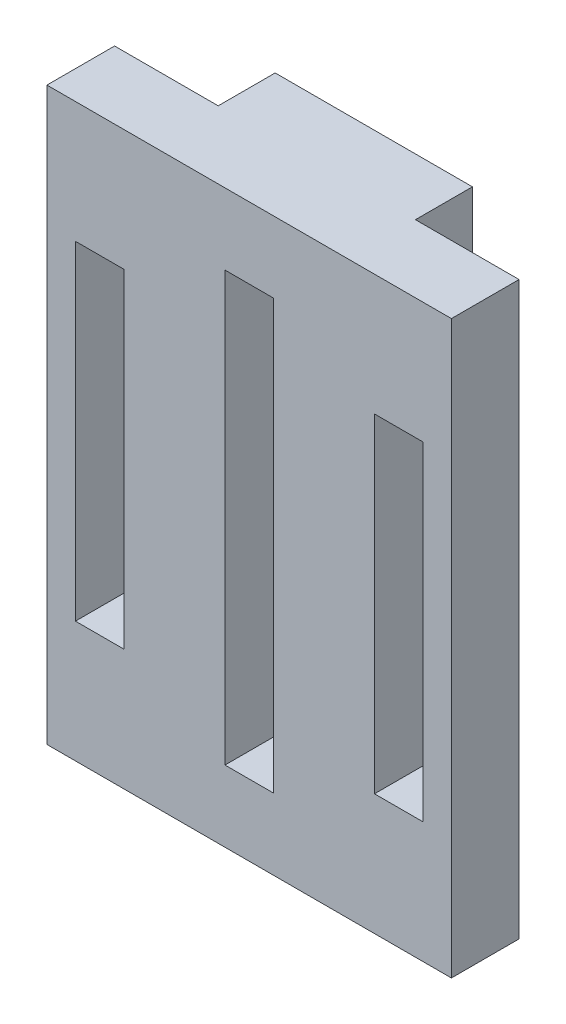
ISO-10303-21;
HEADER;
FILE_DESCRIPTION(('STEP AP214'),'2;1');
FILE_NAME('part.step','',(''),(''),'','','');
FILE_SCHEMA(('AUTOMOTIVE_DESIGN { 1 0 10303 214 1 1 1 1 }'));
ENDSEC;
DATA;
#1=APPLICATION_CONTEXT('core data for automotive mechanical design processes');
#2=APPLICATION_PROTOCOL_DEFINITION('international standard','automotive_design',2000,#1);
#3=PRODUCT_CONTEXT('',#1,'mechanical');
#4=PRODUCT('Part','Part','',(#3));
#5=PRODUCT_RELATED_PRODUCT_CATEGORY('part','',(#4));
#6=PRODUCT_DEFINITION_FORMATION('','',#4);
#7=PRODUCT_DEFINITION_CONTEXT('part definition',#1,'design');
#8=PRODUCT_DEFINITION('design','',#6,#7);
#9=PRODUCT_DEFINITION_SHAPE('','',#8);
#10=(LENGTH_UNIT() NAMED_UNIT(*) SI_UNIT(.MILLI.,.METRE.));
#11=(NAMED_UNIT(*) PLANE_ANGLE_UNIT() SI_UNIT($,.RADIAN.));
#12=(NAMED_UNIT(*) SI_UNIT($,.STERADIAN.) SOLID_ANGLE_UNIT());
#13=UNCERTAINTY_MEASURE_WITH_UNIT(LENGTH_MEASURE(1.E-05),#10,'distance_accuracy_value','');
#14=(GEOMETRIC_REPRESENTATION_CONTEXT(3) GLOBAL_UNCERTAINTY_ASSIGNED_CONTEXT((#13)) GLOBAL_UNIT_ASSIGNED_CONTEXT((#10,
#11,#12)) REPRESENTATION_CONTEXT('',''));
#15=CARTESIAN_POINT('',(0.,0.,0.));
#16=DIRECTION('',(0.,0.,1.));
#17=DIRECTION('',(1.,0.,0.));
#18=AXIS2_PLACEMENT_3D('',#15,#16,#17);
#19=CARTESIAN_POINT('',(0.,0.,0.));
#20=DIRECTION('',(0.,0.,1.));
#21=DIRECTION('',(1.,0.,0.));
#22=AXIS2_PLACEMENT_3D('',#19,#20,#21);
#23=PLANE('',#22);
#24=DIRECTION('',(1.,0.,0.));
#25=VECTOR('',#24,1.);
#26=CARTESIAN_POINT('',(12.2,-11.55,0.));
#27=LINE('',#26,#25);
#28=CARTESIAN_POINT('',(8.8,-11.55,0.));
#29=VERTEX_POINT('',#28);
#30=CARTESIAN_POINT('',(12.2,-11.55,0.));
#31=VERTEX_POINT('',#30);
#32=EDGE_CURVE('E348',#29,#31,#27,.T.);
#33=ORIENTED_EDGE('',*,*,#32,.T.);
#34=DIRECTION('',(0.,1.,0.));
#35=VECTOR('',#34,1.);
#36=CARTESIAN_POINT('',(12.2,-11.55,0.));
#37=LINE('',#36,#35);
#38=CARTESIAN_POINT('',(12.2,11.55,0.));
#39=VERTEX_POINT('',#38);
#40=EDGE_CURVE('E364',#31,#39,#37,.T.);
#41=ORIENTED_EDGE('',*,*,#40,.T.);
#42=DIRECTION('',(-1.,0.,0.));
#43=VECTOR('',#42,1.);
#44=CARTESIAN_POINT('',(12.2,11.55,0.));
#45=LINE('',#44,#43);
#46=CARTESIAN_POINT('',(8.8,11.55,0.));
#47=VERTEX_POINT('',#46);
#48=EDGE_CURVE('E381',#39,#47,#45,.T.);
#49=ORIENTED_EDGE('',*,*,#48,.T.);
#50=DIRECTION('',(0.,-1.,0.));
#51=VECTOR('',#50,1.);
#52=CARTESIAN_POINT('',(8.8,-11.55,0.));
#53=LINE('',#52,#51);
#54=EDGE_CURVE('E377',#47,#29,#53,.T.);
#55=ORIENTED_EDGE('',*,*,#54,.T.);
#56=EDGE_LOOP('',(#33,#41,#49,#55));
#57=FACE_BOUND('',#56,.T.);
#58=DIRECTION('',(1.,0.,0.));
#59=VECTOR('',#58,1.);
#60=CARTESIAN_POINT('',(-12.2,-11.55,0.));
#61=LINE('',#60,#59);
#62=CARTESIAN_POINT('',(-12.2,-11.55,0.));
#63=VERTEX_POINT('',#62);
#64=CARTESIAN_POINT('',(-8.8,-11.55,0.));
#65=VERTEX_POINT('',#64);
#66=EDGE_CURVE('E311',#63,#65,#61,.T.);
#67=ORIENTED_EDGE('',*,*,#66,.T.);
#68=DIRECTION('',(0.,1.,0.));
#69=VECTOR('',#68,1.);
#70=CARTESIAN_POINT('',(-8.8,-11.55,0.));
#71=LINE('',#70,#69);
#72=CARTESIAN_POINT('',(-8.8,11.55,0.));
#73=VERTEX_POINT('',#72);
#74=EDGE_CURVE('E298',#65,#73,#71,.T.);
#75=ORIENTED_EDGE('',*,*,#74,.T.);
#76=DIRECTION('',(-1.,0.,0.));
#77=VECTOR('',#76,1.);
#78=CARTESIAN_POINT('',(-12.2,11.55,0.));
#79=LINE('',#78,#77);
#80=CARTESIAN_POINT('',(-12.2,11.55,0.));
#81=VERTEX_POINT('',#80);
#82=EDGE_CURVE('E302',#73,#81,#79,.T.);
#83=ORIENTED_EDGE('',*,*,#82,.T.);
#84=DIRECTION('',(0.,-1.,0.));
#85=VECTOR('',#84,1.);
#86=CARTESIAN_POINT('',(-12.2,-11.55,0.));
#87=LINE('',#86,#85);
#88=EDGE_CURVE('E307',#81,#63,#87,.T.);
#89=ORIENTED_EDGE('',*,*,#88,.T.);
#90=EDGE_LOOP('',(#67,#75,#83,#89));
#91=FACE_BOUND('',#90,.T.);
#92=DIRECTION('',(0.,-1.,0.));
#93=VECTOR('',#92,1.);
#94=CARTESIAN_POINT('',(6.925,20.05,0.));
#95=LINE('',#94,#93);
#96=CARTESIAN_POINT('',(6.925,20.05,0.));
#97=VERTEX_POINT('',#96);
#98=CARTESIAN_POINT('',(6.925,-18.05,0.));
#99=VERTEX_POINT('',#98);
#100=EDGE_CURVE('E228',#97,#99,#95,.T.);
#101=ORIENTED_EDGE('',*,*,#100,.F.);
#102=DIRECTION('',(-1.,0.,0.));
#103=VECTOR('',#102,1.);
#104=CARTESIAN_POINT('',(-14.2,20.05,0.));
#105=LINE('',#104,#103);
#106=CARTESIAN_POINT('',(14.2,20.05,0.));
#107=VERTEX_POINT('',#106);
#108=EDGE_CURVE('E440',#107,#97,#105,.T.);
#109=ORIENTED_EDGE('',*,*,#108,.F.);
#110=DIRECTION('',(0.,1.,0.));
#111=VECTOR('',#110,1.);
#112=CARTESIAN_POINT('',(14.2,20.05,0.));
#113=LINE('',#112,#111);
#114=CARTESIAN_POINT('',(14.2,-20.05,0.));
#115=VERTEX_POINT('',#114);
#116=EDGE_CURVE('E334',#115,#107,#113,.T.);
#117=ORIENTED_EDGE('',*,*,#116,.F.);
#118=DIRECTION('',(1.,0.,0.));
#119=VECTOR('',#118,1.);
#120=CARTESIAN_POINT('',(-14.2,-20.05,0.));
#121=LINE('',#120,#119);
#122=CARTESIAN_POINT('',(-14.2,-20.05,0.));
#123=VERTEX_POINT('',#122);
#124=EDGE_CURVE('E426',#123,#115,#121,.T.);
#125=ORIENTED_EDGE('',*,*,#124,.F.);
#126=DIRECTION('',(0.,-1.,0.));
#127=VECTOR('',#126,1.);
#128=CARTESIAN_POINT('',(-14.2,20.05,0.));
#129=LINE('',#128,#127);
#130=CARTESIAN_POINT('',(-14.2,20.05,0.));
#131=VERTEX_POINT('',#130);
#132=EDGE_CURVE('E444',#131,#123,#129,.T.);
#133=ORIENTED_EDGE('',*,*,#132,.F.);
#134=CARTESIAN_POINT('',(-6.925,20.05,0.));
#135=VERTEX_POINT('',#134);
#136=EDGE_CURVE('E439',#135,#131,#105,.T.);
#137=ORIENTED_EDGE('',*,*,#136,.F.);
#138=DIRECTION('',(0.,1.,0.));
#139=VECTOR('',#138,1.);
#140=CARTESIAN_POINT('',(-6.925,20.05,0.));
#141=LINE('',#140,#139);
#142=CARTESIAN_POINT('',(-6.925,-18.05,0.));
#143=VERTEX_POINT('',#142);
#144=EDGE_CURVE('E265',#143,#135,#141,.T.);
#145=ORIENTED_EDGE('',*,*,#144,.F.);
#146=DIRECTION('',(-1.,0.,0.));
#147=VECTOR('',#146,1.);
#148=CARTESIAN_POINT('',(6.925,-18.05,0.));
#149=LINE('',#148,#147);
#150=EDGE_CURVE('E64',#99,#143,#149,.T.);
#151=ORIENTED_EDGE('',*,*,#150,.F.);
#152=EDGE_LOOP('',(#101,#109,#117,#125,#133,#137,#145,#151));
#153=FACE_BOUND('',#152,.T.);
#154=ADVANCED_FACE('F45',(#57,#91,#153),#23,.F.);
#155=DIRECTION('',(0.,1.,0.));
#156=VECTOR('',#155,1.);
#157=CARTESIAN_POINT('',(1.7,15.05,0.));
#158=LINE('',#157,#156);
#159=CARTESIAN_POINT('',(1.7,-15.05,0.));
#160=VERTEX_POINT('',#159);
#161=CARTESIAN_POINT('',(1.7,15.05,0.));
#162=VERTEX_POINT('',#161);
#163=EDGE_CURVE('E406',#160,#162,#158,.T.);
#164=ORIENTED_EDGE('',*,*,#163,.T.);
#165=DIRECTION('',(1.,0.,0.));
#166=VECTOR('',#165,1.);
#167=CARTESIAN_POINT('',(3.925,15.05,0.));
#168=LINE('',#167,#166);
#169=CARTESIAN_POINT('',(3.925,15.05,0.));
#170=VERTEX_POINT('',#169);
#171=EDGE_CURVE('E11',#162,#170,#168,.T.);
#172=ORIENTED_EDGE('',*,*,#171,.T.);
#173=DIRECTION('',(0.,-1.,0.));
#174=VECTOR('',#173,1.);
#175=CARTESIAN_POINT('',(3.925,15.05,0.));
#176=LINE('',#175,#174);
#177=CARTESIAN_POINT('',(3.925,-15.05,0.));
#178=VERTEX_POINT('',#177);
#179=EDGE_CURVE('E247',#170,#178,#176,.T.);
#180=ORIENTED_EDGE('',*,*,#179,.T.);
#181=DIRECTION('',(-1.,0.,0.));
#182=VECTOR('',#181,1.);
#183=CARTESIAN_POINT('',(3.925,-15.05,0.));
#184=LINE('',#183,#182);
#185=EDGE_CURVE('E220',#178,#160,#184,.T.);
#186=ORIENTED_EDGE('',*,*,#185,.T.);
#187=EDGE_LOOP('',(#164,#172,#180,#186));
#188=FACE_BOUND('',#187,.T.);
#189=ADVANCED_FACE('F489',(#188),#23,.F.);
#190=CARTESIAN_POINT('',(14.2,20.05,4.75));
#191=DIRECTION('',(-1.,0.,0.));
#192=DIRECTION('',(0.,-1.,0.));
#193=AXIS2_PLACEMENT_3D('',#190,#191,#192);
#194=PLANE('',#193);
#195=ORIENTED_EDGE('',*,*,#116,.T.);
#196=DIRECTION('',(0.,0.,-1.));
#197=VECTOR('',#196,1.);
#198=CARTESIAN_POINT('',(14.2,20.05,4.75));
#199=LINE('',#198,#197);
#200=CARTESIAN_POINT('',(14.2,20.05,4.75));
#201=VERTEX_POINT('',#200);
#202=EDGE_CURVE('E49',#201,#107,#199,.T.);
#203=ORIENTED_EDGE('',*,*,#202,.F.);
#204=DIRECTION('',(0.,1.,0.));
#205=VECTOR('',#204,1.);
#206=CARTESIAN_POINT('',(14.2,20.05,4.75));
#207=LINE('',#206,#205);
#208=CARTESIAN_POINT('',(14.2,-20.05,4.75));
#209=VERTEX_POINT('',#208);
#210=EDGE_CURVE('E421',#209,#201,#207,.T.);
#211=ORIENTED_EDGE('',*,*,#210,.F.);
#212=DIRECTION('',(0.,0.,-1.));
#213=VECTOR('',#212,1.);
#214=CARTESIAN_POINT('',(14.2,-20.05,4.75));
#215=LINE('',#214,#213);
#216=EDGE_CURVE('E435',#209,#115,#215,.T.);
#217=ORIENTED_EDGE('',*,*,#216,.T.);
#218=EDGE_LOOP('',(#195,#203,#211,#217));
#219=FACE_BOUND('',#218,.T.);
#220=ADVANCED_FACE('F47',(#219),#194,.F.);
#221=CARTESIAN_POINT('',(-14.2,20.05,4.75));
#222=DIRECTION('',(0.,-1.,0.));
#223=DIRECTION('',(0.,0.,-1.));
#224=AXIS2_PLACEMENT_3D('',#221,#222,#223);
#225=PLANE('',#224);
#226=ORIENTED_EDGE('',*,*,#108,.T.);
#227=DIRECTION('',(0.,0.,1.));
#228=VECTOR('',#227,1.);
#229=CARTESIAN_POINT('',(6.925,20.05,-4.));
#230=LINE('',#229,#228);
#231=CARTESIAN_POINT('',(6.925,20.05,-4.));
#232=VERTEX_POINT('',#231);
#233=EDGE_CURVE('E274',#232,#97,#230,.T.);
#234=ORIENTED_EDGE('',*,*,#233,.F.);
#235=DIRECTION('',(1.,0.,0.));
#236=VECTOR('',#235,1.);
#237=CARTESIAN_POINT('',(6.925,20.05,-4.));
#238=LINE('',#237,#236);
#239=CARTESIAN_POINT('',(-6.925,20.05,-4.));
#240=VERTEX_POINT('',#239);
#241=EDGE_CURVE('E271',#240,#232,#238,.T.);
#242=ORIENTED_EDGE('',*,*,#241,.F.);
#243=DIRECTION('',(0.,0.,1.));
#244=VECTOR('',#243,1.);
#245=CARTESIAN_POINT('',(-6.925,20.05,-4.));
#246=LINE('',#245,#244);
#247=EDGE_CURVE('E286',#240,#135,#246,.T.);
#248=ORIENTED_EDGE('',*,*,#247,.T.);
#249=ORIENTED_EDGE('',*,*,#136,.T.);
#250=DIRECTION('',(0.,0.,-1.));
#251=VECTOR('',#250,1.);
#252=CARTESIAN_POINT('',(-14.2,20.05,4.75));
#253=LINE('',#252,#251);
#254=CARTESIAN_POINT('',(-14.2,20.05,4.75));
#255=VERTEX_POINT('',#254);
#256=EDGE_CURVE('E455',#255,#131,#253,.T.);
#257=ORIENTED_EDGE('',*,*,#256,.F.);
#258=DIRECTION('',(-1.,0.,0.));
#259=VECTOR('',#258,1.);
#260=CARTESIAN_POINT('',(-14.2,20.05,4.75));
#261=LINE('',#260,#259);
#262=EDGE_CURVE('E425',#201,#255,#261,.T.);
#263=ORIENTED_EDGE('',*,*,#262,.F.);
#264=ORIENTED_EDGE('',*,*,#202,.T.);
#265=EDGE_LOOP('',(#226,#234,#242,#248,#249,#257,#263,#264));
#266=FACE_BOUND('',#265,.T.);
#267=ADVANCED_FACE('F586',(#266),#225,.F.);
#268=CARTESIAN_POINT('',(-14.2,20.05,4.75));
#269=DIRECTION('',(1.,0.,0.));
#270=DIRECTION('',(0.,1.,0.));
#271=AXIS2_PLACEMENT_3D('',#268,#269,#270);
#272=PLANE('',#271);
#273=ORIENTED_EDGE('',*,*,#132,.T.);
#274=DIRECTION('',(0.,0.,-1.));
#275=VECTOR('',#274,1.);
#276=CARTESIAN_POINT('',(-14.2,-20.05,4.75));
#277=LINE('',#276,#275);
#278=CARTESIAN_POINT('',(-14.2,-20.05,4.75));
#279=VERTEX_POINT('',#278);
#280=EDGE_CURVE('E452',#279,#123,#277,.T.);
#281=ORIENTED_EDGE('',*,*,#280,.F.);
#282=DIRECTION('',(0.,-1.,0.));
#283=VECTOR('',#282,1.);
#284=CARTESIAN_POINT('',(-14.2,20.05,4.75));
#285=LINE('',#284,#283);
#286=EDGE_CURVE('E429',#255,#279,#285,.T.);
#287=ORIENTED_EDGE('',*,*,#286,.F.);
#288=ORIENTED_EDGE('',*,*,#256,.T.);
#289=EDGE_LOOP('',(#273,#281,#287,#288));
#290=FACE_BOUND('',#289,.T.);
#291=ADVANCED_FACE('F523',(#290),#272,.F.);
#292=CARTESIAN_POINT('',(-14.2,-20.05,4.75));
#293=DIRECTION('',(0.,1.,0.));
#294=DIRECTION('',(0.,0.,1.));
#295=AXIS2_PLACEMENT_3D('',#292,#293,#294);
#296=PLANE('',#295);
#297=ORIENTED_EDGE('',*,*,#124,.T.);
#298=ORIENTED_EDGE('',*,*,#216,.F.);
#299=DIRECTION('',(1.,0.,0.));
#300=VECTOR('',#299,1.);
#301=CARTESIAN_POINT('',(-14.2,-20.05,4.75));
#302=LINE('',#301,#300);
#303=EDGE_CURVE('E432',#279,#209,#302,.T.);
#304=ORIENTED_EDGE('',*,*,#303,.F.);
#305=ORIENTED_EDGE('',*,*,#280,.T.);
#306=EDGE_LOOP('',(#297,#298,#304,#305));
#307=FACE_BOUND('',#306,.T.);
#308=ADVANCED_FACE('F517',(#307),#296,.F.);
#309=CARTESIAN_POINT('',(0.,0.,4.75));
#310=DIRECTION('',(0.,0.,1.));
#311=DIRECTION('',(1.,0.,0.));
#312=AXIS2_PLACEMENT_3D('',#309,#310,#311);
#313=PLANE('',#312);
#314=DIRECTION('',(0.,1.,0.));
#315=VECTOR('',#314,1.);
#316=CARTESIAN_POINT('',(-8.8,-11.55,4.75));
#317=LINE('',#316,#315);
#318=CARTESIAN_POINT('',(-8.8,-11.55,4.75));
#319=VERTEX_POINT('',#318);
#320=CARTESIAN_POINT('',(-8.8,11.55,4.75));
#321=VERTEX_POINT('',#320);
#322=EDGE_CURVE('E316',#319,#321,#317,.T.);
#323=ORIENTED_EDGE('',*,*,#322,.F.);
#324=DIRECTION('',(1.,0.,0.));
#325=VECTOR('',#324,1.);
#326=CARTESIAN_POINT('',(-12.2,-11.55,4.75));
#327=LINE('',#326,#325);
#328=CARTESIAN_POINT('',(-12.2,-11.55,4.75));
#329=VERTEX_POINT('',#328);
#330=EDGE_CURVE('E303',#329,#319,#327,.T.);
#331=ORIENTED_EDGE('',*,*,#330,.F.);
#332=DIRECTION('',(0.,-1.,0.));
#333=VECTOR('',#332,1.);
#334=CARTESIAN_POINT('',(-12.2,-11.55,4.75));
#335=LINE('',#334,#333);
#336=CARTESIAN_POINT('',(-12.2,11.55,4.75));
#337=VERTEX_POINT('',#336);
#338=EDGE_CURVE('E324',#337,#329,#335,.T.);
#339=ORIENTED_EDGE('',*,*,#338,.F.);
#340=DIRECTION('',(-1.,0.,0.));
#341=VECTOR('',#340,1.);
#342=CARTESIAN_POINT('',(-12.2,11.55,4.75));
#343=LINE('',#342,#341);
#344=EDGE_CURVE('E319',#321,#337,#343,.T.);
#345=ORIENTED_EDGE('',*,*,#344,.F.);
#346=EDGE_LOOP('',(#323,#331,#339,#345));
#347=FACE_BOUND('',#346,.T.);
#348=DIRECTION('',(0.,1.,0.));
#349=VECTOR('',#348,1.);
#350=CARTESIAN_POINT('',(12.2,-11.55,4.75));
#351=LINE('',#350,#349);
#352=CARTESIAN_POINT('',(12.2,-11.55,4.75));
#353=VERTEX_POINT('',#352);
#354=CARTESIAN_POINT('',(12.2,11.55,4.75));
#355=VERTEX_POINT('',#354);
#356=EDGE_CURVE('E320',#353,#355,#351,.T.);
#357=ORIENTED_EDGE('',*,*,#356,.F.);
#358=DIRECTION('',(1.,0.,0.));
#359=VECTOR('',#358,1.);
#360=CARTESIAN_POINT('',(12.2,-11.55,4.75));
#361=LINE('',#360,#359);
#362=CARTESIAN_POINT('',(8.8,-11.55,4.75));
#363=VERTEX_POINT('',#362);
#364=EDGE_CURVE('E359',#363,#353,#361,.T.);
#365=ORIENTED_EDGE('',*,*,#364,.F.);
#366=DIRECTION('',(0.,-1.,0.));
#367=VECTOR('',#366,1.);
#368=CARTESIAN_POINT('',(8.8,-11.55,4.75));
#369=LINE('',#368,#367);
#370=CARTESIAN_POINT('',(8.8,11.55,4.75));
#371=VERTEX_POINT('',#370);
#372=EDGE_CURVE('E363',#371,#363,#369,.T.);
#373=ORIENTED_EDGE('',*,*,#372,.F.);
#374=DIRECTION('',(-1.,0.,0.));
#375=VECTOR('',#374,1.);
#376=CARTESIAN_POINT('',(12.2,11.55,4.75));
#377=LINE('',#376,#375);
#378=EDGE_CURVE('E368',#355,#371,#377,.T.);
#379=ORIENTED_EDGE('',*,*,#378,.F.);
#380=EDGE_LOOP('',(#357,#365,#373,#379));
#381=FACE_BOUND('',#380,.T.);
#382=DIRECTION('',(0.,1.,0.));
#383=VECTOR('',#382,1.);
#384=CARTESIAN_POINT('',(1.7,15.05,4.75));
#385=LINE('',#384,#383);
#386=CARTESIAN_POINT('',(1.7,-15.05,4.75));
#387=VERTEX_POINT('',#386);
#388=CARTESIAN_POINT('',(1.7,15.05,4.75));
#389=VERTEX_POINT('',#388);
#390=EDGE_CURVE('E358',#387,#389,#385,.T.);
#391=ORIENTED_EDGE('',*,*,#390,.F.);
#392=DIRECTION('',(1.,0.,0.));
#393=VECTOR('',#392,1.);
#394=CARTESIAN_POINT('',(-1.7,-15.05,4.75));
#395=LINE('',#394,#393);
#396=CARTESIAN_POINT('',(-1.7,-15.05,4.75));
#397=VERTEX_POINT('',#396);
#398=EDGE_CURVE('E401',#397,#387,#395,.T.);
#399=ORIENTED_EDGE('',*,*,#398,.F.);
#400=DIRECTION('',(0.,-1.,0.));
#401=VECTOR('',#400,1.);
#402=CARTESIAN_POINT('',(-1.7,15.05,4.75));
#403=LINE('',#402,#401);
#404=CARTESIAN_POINT('',(-1.7,15.05,4.75));
#405=VERTEX_POINT('',#404);
#406=EDGE_CURVE('E405',#405,#397,#403,.T.);
#407=ORIENTED_EDGE('',*,*,#406,.F.);
#408=DIRECTION('',(-1.,0.,0.));
#409=VECTOR('',#408,1.);
#410=CARTESIAN_POINT('',(-1.7,15.05,4.75));
#411=LINE('',#410,#409);
#412=EDGE_CURVE('E410',#389,#405,#411,.T.);
#413=ORIENTED_EDGE('',*,*,#412,.F.);
#414=EDGE_LOOP('',(#391,#399,#407,#413));
#415=FACE_BOUND('',#414,.T.);
#416=ORIENTED_EDGE('',*,*,#210,.T.);
#417=ORIENTED_EDGE('',*,*,#262,.T.);
#418=ORIENTED_EDGE('',*,*,#286,.T.);
#419=ORIENTED_EDGE('',*,*,#303,.T.);
#420=EDGE_LOOP('',(#416,#417,#418,#419));
#421=FACE_BOUND('',#420,.T.);
#422=ADVANCED_FACE('F480',(#347,#381,#415,#421),#313,.T.);
#423=DIRECTION('',(0.,1.,0.));
#424=VECTOR('',#423,1.);
#425=CARTESIAN_POINT('',(-3.925,15.05,0.));
#426=LINE('',#425,#424);
#427=CARTESIAN_POINT('',(-3.925,-15.05,0.));
#428=VERTEX_POINT('',#427);
#429=CARTESIAN_POINT('',(-3.925,15.05,0.));
#430=VERTEX_POINT('',#429);
#431=EDGE_CURVE('E243',#428,#430,#426,.T.);
#432=ORIENTED_EDGE('',*,*,#431,.T.);
#433=CARTESIAN_POINT('',(-1.7,15.05,0.));
#434=VERTEX_POINT('',#433);
#435=EDGE_CURVE('E57',#430,#434,#168,.T.);
#436=ORIENTED_EDGE('',*,*,#435,.T.);
#437=DIRECTION('',(0.,-1.,0.));
#438=VECTOR('',#437,1.);
#439=CARTESIAN_POINT('',(-1.7,15.05,0.));
#440=LINE('',#439,#438);
#441=CARTESIAN_POINT('',(-1.7,-15.05,0.));
#442=VERTEX_POINT('',#441);
#443=EDGE_CURVE('E392',#434,#442,#440,.T.);
#444=ORIENTED_EDGE('',*,*,#443,.T.);
#445=EDGE_CURVE('E55',#442,#428,#184,.T.);
#446=ORIENTED_EDGE('',*,*,#445,.T.);
#447=EDGE_LOOP('',(#432,#436,#444,#446));
#448=FACE_BOUND('',#447,.T.);
#449=ADVANCED_FACE('F469',(#448),#23,.F.);
#450=CARTESIAN_POINT('',(1.7,15.05,0.));
#451=DIRECTION('',(1.,0.,0.));
#452=DIRECTION('',(0.,1.,0.));
#453=AXIS2_PLACEMENT_3D('',#450,#451,#452);
#454=PLANE('',#453);
#455=ORIENTED_EDGE('',*,*,#390,.T.);
#456=DIRECTION('',(0.,0.,1.));
#457=VECTOR('',#456,1.);
#458=CARTESIAN_POINT('',(1.7,15.05,0.));
#459=LINE('',#458,#457);
#460=EDGE_CURVE('E388',#162,#389,#459,.T.);
#461=ORIENTED_EDGE('',*,*,#460,.F.);
#462=ORIENTED_EDGE('',*,*,#163,.F.);
#463=DIRECTION('',(0.,0.,1.));
#464=VECTOR('',#463,1.);
#465=CARTESIAN_POINT('',(1.7,-15.05,0.));
#466=LINE('',#465,#464);
#467=EDGE_CURVE('E297',#160,#387,#466,.T.);
#468=ORIENTED_EDGE('',*,*,#467,.T.);
#469=EDGE_LOOP('',(#455,#461,#462,#468));
#470=FACE_BOUND('',#469,.T.);
#471=ADVANCED_FACE('F487',(#470),#454,.F.);
#472=CARTESIAN_POINT('',(-1.7,-15.05,0.));
#473=DIRECTION('',(0.,-1.,0.));
#474=DIRECTION('',(0.,0.,-1.));
#475=AXIS2_PLACEMENT_3D('',#472,#473,#474);
#476=PLANE('',#475);
#477=ORIENTED_EDGE('',*,*,#398,.T.);
#478=ORIENTED_EDGE('',*,*,#467,.F.);
#479=ORIENTED_EDGE('',*,*,#185,.F.);
#480=DIRECTION('',(0.,0.,1.));
#481=VECTOR('',#480,1.);
#482=CARTESIAN_POINT('',(3.925,-15.05,-4.));
#483=LINE('',#482,#481);
#484=CARTESIAN_POINT('',(3.925,-15.05,-4.));
#485=VERTEX_POINT('',#484);
#486=EDGE_CURVE('E255',#485,#178,#483,.T.);
#487=ORIENTED_EDGE('',*,*,#486,.F.);
#488=DIRECTION('',(-1.,0.,0.));
#489=VECTOR('',#488,1.);
#490=CARTESIAN_POINT('',(3.925,-15.05,-4.));
#491=LINE('',#490,#489);
#492=CARTESIAN_POINT('',(-3.925,-15.05,-4.));
#493=VERTEX_POINT('',#492);
#494=EDGE_CURVE('E238',#485,#493,#491,.T.);
#495=ORIENTED_EDGE('',*,*,#494,.T.);
#496=DIRECTION('',(0.,0.,1.));
#497=VECTOR('',#496,1.);
#498=CARTESIAN_POINT('',(-3.925,-15.05,-4.));
#499=LINE('',#498,#497);
#500=EDGE_CURVE('E72',#493,#428,#499,.T.);
#501=ORIENTED_EDGE('',*,*,#500,.T.);
#502=ORIENTED_EDGE('',*,*,#445,.F.);
#503=DIRECTION('',(0.,0.,1.));
#504=VECTOR('',#503,1.);
#505=CARTESIAN_POINT('',(-1.7,-15.05,0.));
#506=LINE('',#505,#504);
#507=EDGE_CURVE('E396',#442,#397,#506,.T.);
#508=ORIENTED_EDGE('',*,*,#507,.T.);
#509=EDGE_LOOP('',(#477,#478,#479,#487,#495,#501,#502,#508));
#510=FACE_BOUND('',#509,.T.);
#511=ADVANCED_FACE('F472',(#510),#476,.F.);
#512=CARTESIAN_POINT('',(-1.7,15.05,0.));
#513=DIRECTION('',(-1.,0.,0.));
#514=DIRECTION('',(0.,-1.,0.));
#515=AXIS2_PLACEMENT_3D('',#512,#513,#514);
#516=PLANE('',#515);
#517=ORIENTED_EDGE('',*,*,#406,.T.);
#518=ORIENTED_EDGE('',*,*,#507,.F.);
#519=ORIENTED_EDGE('',*,*,#443,.F.);
#520=DIRECTION('',(0.,0.,1.));
#521=VECTOR('',#520,1.);
#522=CARTESIAN_POINT('',(-1.7,15.05,0.));
#523=LINE('',#522,#521);
#524=EDGE_CURVE('E393',#434,#405,#523,.T.);
#525=ORIENTED_EDGE('',*,*,#524,.T.);
#526=EDGE_LOOP('',(#517,#518,#519,#525));
#527=FACE_BOUND('',#526,.T.);
#528=ADVANCED_FACE('F474',(#527),#516,.F.);
#529=CARTESIAN_POINT('',(-1.7,15.05,0.));
#530=DIRECTION('',(0.,1.,0.));
#531=DIRECTION('',(0.,0.,1.));
#532=AXIS2_PLACEMENT_3D('',#529,#530,#531);
#533=PLANE('',#532);
#534=ORIENTED_EDGE('',*,*,#412,.T.);
#535=ORIENTED_EDGE('',*,*,#524,.F.);
#536=ORIENTED_EDGE('',*,*,#435,.F.);
#537=DIRECTION('',(0.,0.,1.));
#538=VECTOR('',#537,1.);
#539=CARTESIAN_POINT('',(-3.925,15.05,-4.));
#540=LINE('',#539,#538);
#541=CARTESIAN_POINT('',(-3.925,15.05,-4.));
#542=VERTEX_POINT('',#541);
#543=EDGE_CURVE('E213',#542,#430,#540,.T.);
#544=ORIENTED_EDGE('',*,*,#543,.F.);
#545=DIRECTION('',(1.,0.,0.));
#546=VECTOR('',#545,1.);
#547=CARTESIAN_POINT('',(3.925,15.05,-4.));
#548=LINE('',#547,#546);
#549=CARTESIAN_POINT('',(3.925,15.05,-4.));
#550=VERTEX_POINT('',#549);
#551=EDGE_CURVE('E219',#542,#550,#548,.T.);
#552=ORIENTED_EDGE('',*,*,#551,.T.);
#553=DIRECTION('',(0.,0.,1.));
#554=VECTOR('',#553,1.);
#555=CARTESIAN_POINT('',(3.925,15.05,-4.));
#556=LINE('',#555,#554);
#557=EDGE_CURVE('E229',#550,#170,#556,.T.);
#558=ORIENTED_EDGE('',*,*,#557,.T.);
#559=ORIENTED_EDGE('',*,*,#171,.F.);
#560=ORIENTED_EDGE('',*,*,#460,.T.);
#561=EDGE_LOOP('',(#534,#535,#536,#544,#552,#558,#559,#560));
#562=FACE_BOUND('',#561,.T.);
#563=ADVANCED_FACE('F224',(#562),#533,.F.);
#564=CARTESIAN_POINT('',(12.2,-11.55,0.));
#565=DIRECTION('',(1.,0.,0.));
#566=DIRECTION('',(0.,0.,-1.));
#567=AXIS2_PLACEMENT_3D('',#564,#565,#566);
#568=PLANE('',#567);
#569=ORIENTED_EDGE('',*,*,#356,.T.);
#570=DIRECTION('',(0.,0.,1.));
#571=VECTOR('',#570,1.);
#572=CARTESIAN_POINT('',(12.2,11.55,0.));
#573=LINE('',#572,#571);
#574=EDGE_CURVE('E344',#39,#355,#573,.T.);
#575=ORIENTED_EDGE('',*,*,#574,.F.);
#576=ORIENTED_EDGE('',*,*,#40,.F.);
#577=DIRECTION('',(0.,0.,1.));
#578=VECTOR('',#577,1.);
#579=CARTESIAN_POINT('',(12.2,-11.55,0.));
#580=LINE('',#579,#578);
#581=EDGE_CURVE('E355',#31,#353,#580,.T.);
#582=ORIENTED_EDGE('',*,*,#581,.T.);
#583=EDGE_LOOP('',(#569,#575,#576,#582));
#584=FACE_BOUND('',#583,.T.);
#585=ADVANCED_FACE('F533',(#584),#568,.F.);
#586=CARTESIAN_POINT('',(12.2,-11.55,0.));
#587=DIRECTION('',(0.,-1.,0.));
#588=DIRECTION('',(0.,0.,-1.));
#589=AXIS2_PLACEMENT_3D('',#586,#587,#588);
#590=PLANE('',#589);
#591=ORIENTED_EDGE('',*,*,#364,.T.);
#592=ORIENTED_EDGE('',*,*,#581,.F.);
#593=ORIENTED_EDGE('',*,*,#32,.F.);
#594=DIRECTION('',(0.,0.,1.));
#595=VECTOR('',#594,1.);
#596=CARTESIAN_POINT('',(8.8,-11.55,0.));
#597=LINE('',#596,#595);
#598=EDGE_CURVE('E352',#29,#363,#597,.T.);
#599=ORIENTED_EDGE('',*,*,#598,.T.);
#600=EDGE_LOOP('',(#591,#592,#593,#599));
#601=FACE_BOUND('',#600,.T.);
#602=ADVANCED_FACE('F535',(#601),#590,.F.);
#603=CARTESIAN_POINT('',(8.8,-11.55,0.));
#604=DIRECTION('',(-1.,0.,0.));
#605=DIRECTION('',(0.,0.,1.));
#606=AXIS2_PLACEMENT_3D('',#603,#604,#605);
#607=PLANE('',#606);
#608=ORIENTED_EDGE('',*,*,#372,.T.);
#609=ORIENTED_EDGE('',*,*,#598,.F.);
#610=ORIENTED_EDGE('',*,*,#54,.F.);
#611=DIRECTION('',(0.,0.,1.));
#612=VECTOR('',#611,1.);
#613=CARTESIAN_POINT('',(8.8,11.55,0.));
#614=LINE('',#613,#612);
#615=EDGE_CURVE('E349',#47,#371,#614,.T.);
#616=ORIENTED_EDGE('',*,*,#615,.T.);
#617=EDGE_LOOP('',(#608,#609,#610,#616));
#618=FACE_BOUND('',#617,.T.);
#619=ADVANCED_FACE('F538',(#618),#607,.F.);
#620=CARTESIAN_POINT('',(12.2,11.55,0.));
#621=DIRECTION('',(0.,1.,0.));
#622=DIRECTION('',(0.,0.,1.));
#623=AXIS2_PLACEMENT_3D('',#620,#621,#622);
#624=PLANE('',#623);
#625=ORIENTED_EDGE('',*,*,#378,.T.);
#626=ORIENTED_EDGE('',*,*,#615,.F.);
#627=ORIENTED_EDGE('',*,*,#48,.F.);
#628=ORIENTED_EDGE('',*,*,#574,.T.);
#629=EDGE_LOOP('',(#625,#626,#627,#628));
#630=FACE_BOUND('',#629,.T.);
#631=ADVANCED_FACE('F542',(#630),#624,.F.);
#632=CARTESIAN_POINT('',(-8.8,-11.55,0.));
#633=DIRECTION('',(1.,0.,0.));
#634=DIRECTION('',(0.,0.,-1.));
#635=AXIS2_PLACEMENT_3D('',#632,#633,#634);
#636=PLANE('',#635);
#637=ORIENTED_EDGE('',*,*,#322,.T.);
#638=DIRECTION('',(0.,0.,1.));
#639=VECTOR('',#638,1.);
#640=CARTESIAN_POINT('',(-8.8,11.55,0.));
#641=LINE('',#640,#639);
#642=EDGE_CURVE('E315',#73,#321,#641,.T.);
#643=ORIENTED_EDGE('',*,*,#642,.F.);
#644=ORIENTED_EDGE('',*,*,#74,.F.);
#645=DIRECTION('',(0.,0.,1.));
#646=VECTOR('',#645,1.);
#647=CARTESIAN_POINT('',(-8.8,-11.55,0.));
#648=LINE('',#647,#646);
#649=EDGE_CURVE('E331',#65,#319,#648,.T.);
#650=ORIENTED_EDGE('',*,*,#649,.T.);
#651=EDGE_LOOP('',(#637,#643,#644,#650));
#652=FACE_BOUND('',#651,.T.);
#653=ADVANCED_FACE('F546',(#652),#636,.F.);
#654=CARTESIAN_POINT('',(-12.2,-11.55,0.));
#655=DIRECTION('',(0.,-1.,0.));
#656=DIRECTION('',(0.,0.,-1.));
#657=AXIS2_PLACEMENT_3D('',#654,#655,#656);
#658=PLANE('',#657);
#659=ORIENTED_EDGE('',*,*,#330,.T.);
#660=ORIENTED_EDGE('',*,*,#649,.F.);
#661=ORIENTED_EDGE('',*,*,#66,.F.);
#662=DIRECTION('',(0.,0.,1.));
#663=VECTOR('',#662,1.);
#664=CARTESIAN_POINT('',(-12.2,-11.55,0.));
#665=LINE('',#664,#663);
#666=EDGE_CURVE('E335',#63,#329,#665,.T.);
#667=ORIENTED_EDGE('',*,*,#666,.T.);
#668=EDGE_LOOP('',(#659,#660,#661,#667));
#669=FACE_BOUND('',#668,.T.);
#670=ADVANCED_FACE('F552',(#669),#658,.F.);
#671=CARTESIAN_POINT('',(-12.2,-11.55,0.));
#672=DIRECTION('',(-1.,0.,0.));
#673=DIRECTION('',(0.,0.,1.));
#674=AXIS2_PLACEMENT_3D('',#671,#672,#673);
#675=PLANE('',#674);
#676=ORIENTED_EDGE('',*,*,#338,.T.);
#677=ORIENTED_EDGE('',*,*,#666,.F.);
#678=ORIENTED_EDGE('',*,*,#88,.F.);
#679=DIRECTION('',(0.,0.,1.));
#680=VECTOR('',#679,1.);
#681=CARTESIAN_POINT('',(-12.2,11.55,0.));
#682=LINE('',#681,#680);
#683=EDGE_CURVE('E338',#81,#337,#682,.T.);
#684=ORIENTED_EDGE('',*,*,#683,.T.);
#685=EDGE_LOOP('',(#676,#677,#678,#684));
#686=FACE_BOUND('',#685,.T.);
#687=ADVANCED_FACE('F556',(#686),#675,.F.);
#688=CARTESIAN_POINT('',(-12.2,11.55,0.));
#689=DIRECTION('',(0.,1.,0.));
#690=DIRECTION('',(0.,0.,1.));
#691=AXIS2_PLACEMENT_3D('',#688,#689,#690);
#692=PLANE('',#691);
#693=ORIENTED_EDGE('',*,*,#344,.T.);
#694=ORIENTED_EDGE('',*,*,#683,.F.);
#695=ORIENTED_EDGE('',*,*,#82,.F.);
#696=ORIENTED_EDGE('',*,*,#642,.T.);
#697=EDGE_LOOP('',(#693,#694,#695,#696));
#698=FACE_BOUND('',#697,.T.);
#699=ADVANCED_FACE('F554',(#698),#692,.F.);
#700=CARTESIAN_POINT('',(0.,0.,-4.));
#701=DIRECTION('',(0.,0.,-1.));
#702=DIRECTION('',(-1.,0.,0.));
#703=AXIS2_PLACEMENT_3D('',#700,#701,#702);
#704=PLANE('',#703);
#705=DIRECTION('',(0.,-1.,0.));
#706=VECTOR('',#705,1.);
#707=CARTESIAN_POINT('',(6.925,20.05,-4.));
#708=LINE('',#707,#706);
#709=CARTESIAN_POINT('',(6.925,-18.05,-4.));
#710=VERTEX_POINT('',#709);
#711=EDGE_CURVE('E260',#232,#710,#708,.T.);
#712=ORIENTED_EDGE('',*,*,#711,.T.);
#713=DIRECTION('',(-1.,0.,0.));
#714=VECTOR('',#713,1.);
#715=CARTESIAN_POINT('',(6.925,-18.05,-4.));
#716=LINE('',#715,#714);
#717=CARTESIAN_POINT('',(-6.925,-18.05,-4.));
#718=VERTEX_POINT('',#717);
#719=EDGE_CURVE('E264',#710,#718,#716,.T.);
#720=ORIENTED_EDGE('',*,*,#719,.T.);
#721=DIRECTION('',(0.,1.,0.));
#722=VECTOR('',#721,1.);
#723=CARTESIAN_POINT('',(-6.925,20.05,-4.));
#724=LINE('',#723,#722);
#725=EDGE_CURVE('E268',#718,#240,#724,.T.);
#726=ORIENTED_EDGE('',*,*,#725,.T.);
#727=ORIENTED_EDGE('',*,*,#241,.T.);
#728=EDGE_LOOP('',(#712,#720,#726,#727));
#729=FACE_BOUND('',#728,.T.);
#730=ORIENTED_EDGE('',*,*,#551,.F.);
#731=DIRECTION('',(0.,1.,0.));
#732=VECTOR('',#731,1.);
#733=CARTESIAN_POINT('',(-3.925,15.05,-4.));
#734=LINE('',#733,#732);
#735=EDGE_CURVE('E210',#493,#542,#734,.T.);
#736=ORIENTED_EDGE('',*,*,#735,.F.);
#737=ORIENTED_EDGE('',*,*,#494,.F.);
#738=DIRECTION('',(0.,-1.,0.));
#739=VECTOR('',#738,1.);
#740=CARTESIAN_POINT('',(3.925,15.05,-4.));
#741=LINE('',#740,#739);
#742=EDGE_CURVE('E234',#550,#485,#741,.T.);
#743=ORIENTED_EDGE('',*,*,#742,.F.);
#744=EDGE_LOOP('',(#730,#736,#737,#743));
#745=FACE_BOUND('',#744,.T.);
#746=ADVANCED_FACE('F232',(#729,#745),#704,.T.);
#747=CARTESIAN_POINT('',(6.925,20.05,-4.));
#748=DIRECTION('',(-1.,0.,0.));
#749=DIRECTION('',(0.,-1.,0.));
#750=AXIS2_PLACEMENT_3D('',#747,#748,#749);
#751=PLANE('',#750);
#752=ORIENTED_EDGE('',*,*,#100,.T.);
#753=DIRECTION('',(0.,0.,1.));
#754=VECTOR('',#753,1.);
#755=CARTESIAN_POINT('',(6.925,-18.05,-4.));
#756=LINE('',#755,#754);
#757=EDGE_CURVE('E294',#710,#99,#756,.T.);
#758=ORIENTED_EDGE('',*,*,#757,.F.);
#759=ORIENTED_EDGE('',*,*,#711,.F.);
#760=ORIENTED_EDGE('',*,*,#233,.T.);
#761=EDGE_LOOP('',(#752,#758,#759,#760));
#762=FACE_BOUND('',#761,.T.);
#763=ADVANCED_FACE('F564',(#762),#751,.F.);
#764=CARTESIAN_POINT('',(6.925,-18.05,-4.));
#765=DIRECTION('',(0.,1.,0.));
#766=DIRECTION('',(0.,0.,1.));
#767=AXIS2_PLACEMENT_3D('',#764,#765,#766);
#768=PLANE('',#767);
#769=ORIENTED_EDGE('',*,*,#150,.T.);
#770=DIRECTION('',(0.,0.,1.));
#771=VECTOR('',#770,1.);
#772=CARTESIAN_POINT('',(-6.925,-18.05,-4.));
#773=LINE('',#772,#771);
#774=EDGE_CURVE('E290',#718,#143,#773,.T.);
#775=ORIENTED_EDGE('',*,*,#774,.F.);
#776=ORIENTED_EDGE('',*,*,#719,.F.);
#777=ORIENTED_EDGE('',*,*,#757,.T.);
#778=EDGE_LOOP('',(#769,#775,#776,#777));
#779=FACE_BOUND('',#778,.T.);
#780=ADVANCED_FACE('F567',(#779),#768,.F.);
#781=CARTESIAN_POINT('',(-6.925,20.05,-4.));
#782=DIRECTION('',(1.,0.,0.));
#783=DIRECTION('',(0.,1.,0.));
#784=AXIS2_PLACEMENT_3D('',#781,#782,#783);
#785=PLANE('',#784);
#786=ORIENTED_EDGE('',*,*,#144,.T.);
#787=ORIENTED_EDGE('',*,*,#247,.F.);
#788=ORIENTED_EDGE('',*,*,#725,.F.);
#789=ORIENTED_EDGE('',*,*,#774,.T.);
#790=EDGE_LOOP('',(#786,#787,#788,#789));
#791=FACE_BOUND('',#790,.T.);
#792=ADVANCED_FACE('F498',(#791),#785,.F.);
#793=CARTESIAN_POINT('',(-3.925,15.05,-4.));
#794=DIRECTION('',(1.,0.,0.));
#795=DIRECTION('',(0.,1.,0.));
#796=AXIS2_PLACEMENT_3D('',#793,#794,#795);
#797=PLANE('',#796);
#798=ORIENTED_EDGE('',*,*,#431,.F.);
#799=ORIENTED_EDGE('',*,*,#500,.F.);
#800=ORIENTED_EDGE('',*,*,#735,.T.);
#801=ORIENTED_EDGE('',*,*,#543,.T.);
#802=EDGE_LOOP('',(#798,#799,#800,#801));
#803=FACE_BOUND('',#802,.T.);
#804=ADVANCED_FACE('F212',(#803),#797,.T.);
#805=CARTESIAN_POINT('',(3.925,15.05,-4.));
#806=DIRECTION('',(-1.,0.,0.));
#807=DIRECTION('',(0.,-1.,0.));
#808=AXIS2_PLACEMENT_3D('',#805,#806,#807);
#809=PLANE('',#808);
#810=ORIENTED_EDGE('',*,*,#179,.F.);
#811=ORIENTED_EDGE('',*,*,#557,.F.);
#812=ORIENTED_EDGE('',*,*,#742,.T.);
#813=ORIENTED_EDGE('',*,*,#486,.T.);
#814=EDGE_LOOP('',(#810,#811,#812,#813));
#815=FACE_BOUND('',#814,.T.);
#816=ADVANCED_FACE('F492',(#815),#809,.T.);
#817=CLOSED_SHELL('',(#154,#189,#220,#267,#291,#308,#422,#449,#471,#511,#528,#563,#585,#602,
#619,#631,#653,#670,#687,#699,#746,#763,#780,#792,#804,#816));
#818=MANIFOLD_SOLID_BREP('B2',#817);
#819=ADVANCED_BREP_SHAPE_REPRESENTATION('',(#18,#818),#14);
#820=SHAPE_DEFINITION_REPRESENTATION(#9,#819);
ENDSEC;
END-ISO-10303-21;
